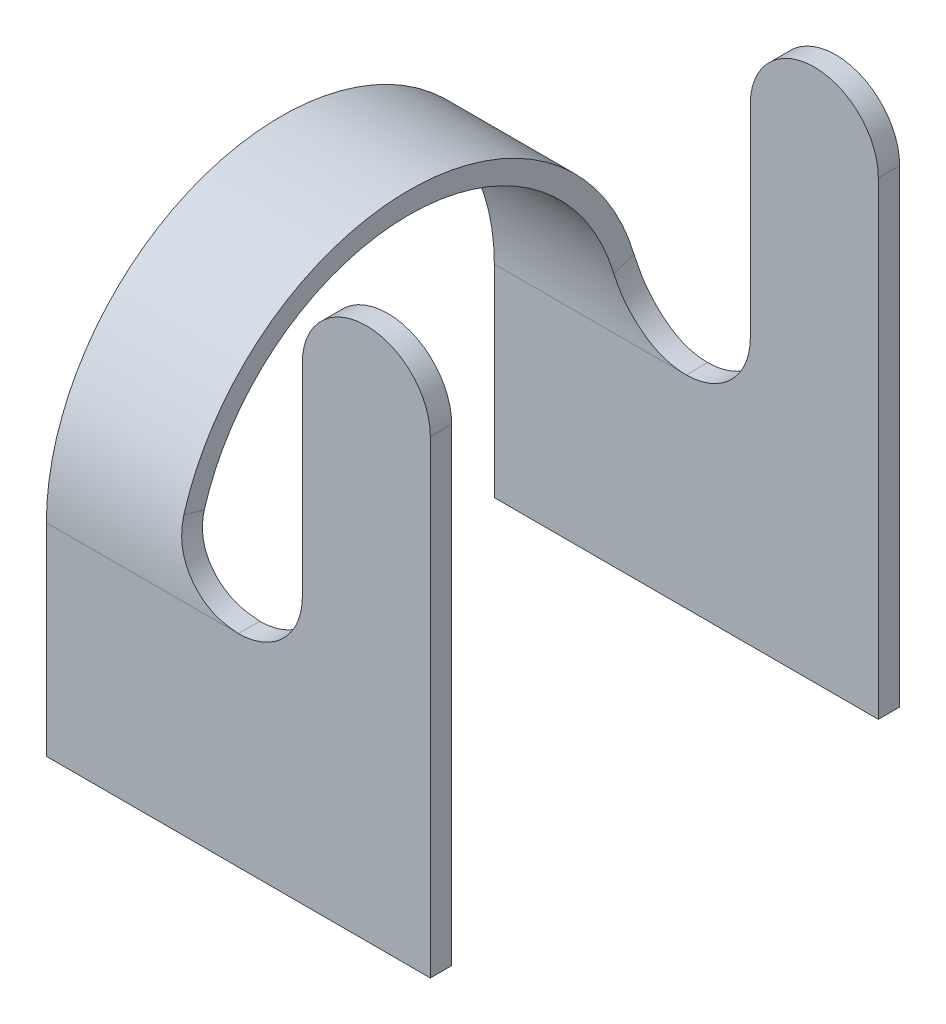
ISO-10303-21;
HEADER;
FILE_DESCRIPTION(('STEP AP214'),'2;1');
FILE_NAME('part.step','',(''),(''),'','','');
FILE_SCHEMA(('AUTOMOTIVE_DESIGN { 1 0 10303 214 1 1 1 1 }'));
ENDSEC;
DATA;
#1=APPLICATION_CONTEXT('core data for automotive mechanical design processes');
#2=APPLICATION_PROTOCOL_DEFINITION('international standard','automotive_design',2000,#1);
#3=PRODUCT_CONTEXT('',#1,'mechanical');
#4=PRODUCT('Part','Part','',(#3));
#5=PRODUCT_RELATED_PRODUCT_CATEGORY('part','',(#4));
#6=PRODUCT_DEFINITION_FORMATION('','',#4);
#7=PRODUCT_DEFINITION_CONTEXT('part definition',#1,'design');
#8=PRODUCT_DEFINITION('design','',#6,#7);
#9=PRODUCT_DEFINITION_SHAPE('','',#8);
#10=(LENGTH_UNIT() NAMED_UNIT(*) SI_UNIT(.MILLI.,.METRE.));
#11=(NAMED_UNIT(*) PLANE_ANGLE_UNIT() SI_UNIT($,.RADIAN.));
#12=(NAMED_UNIT(*) SI_UNIT($,.STERADIAN.) SOLID_ANGLE_UNIT());
#13=UNCERTAINTY_MEASURE_WITH_UNIT(LENGTH_MEASURE(1.E-05),#10,'distance_accuracy_value','');
#14=(GEOMETRIC_REPRESENTATION_CONTEXT(3) GLOBAL_UNCERTAINTY_ASSIGNED_CONTEXT((#13)) GLOBAL_UNIT_ASSIGNED_CONTEXT((#10,
#11,#12)) REPRESENTATION_CONTEXT('',''));
#15=CARTESIAN_POINT('',(0.,0.,0.));
#16=DIRECTION('',(0.,0.,1.));
#17=DIRECTION('',(1.,0.,0.));
#18=AXIS2_PLACEMENT_3D('',#15,#16,#17);
#19=CARTESIAN_POINT('',(0.,-26.9867228626931,42.));
#20=DIRECTION('',(0.,0.,-1.));
#21=DIRECTION('',(1.,0.,0.));
#22=AXIS2_PLACEMENT_3D('',#19,#20,#21);
#23=CYLINDRICAL_SURFACE('',#22,6.);
#24=CARTESIAN_POINT('',(0.,-26.9867228626931,40.));
#25=DIRECTION('',(0.,0.,-1.));
#26=DIRECTION('',(1.,0.,0.));
#27=AXIS2_PLACEMENT_3D('',#24,#25,#26);
#28=CIRCLE('',#27,6.);
#29=CARTESIAN_POINT('',(5.99999999999995,-26.9867228626931,40.));
#30=VERTEX_POINT('',#29);
#31=CARTESIAN_POINT('',(0.,-32.9867228626931,40.));
#32=VERTEX_POINT('',#31);
#33=EDGE_CURVE('E81',#30,#32,#28,.T.);
#34=ORIENTED_EDGE('',*,*,#33,.T.);
#35=CARTESIAN_POINT('',(0.,-32.9867228626928,42.));
#36=CARTESIAN_POINT('',(0.,-32.9867228626928,40.));
#37=B_SPLINE_CURVE_WITH_KNOTS('',1,(#35,#36),.UNSPECIFIED.,.F.,.F.,(2,2),(0.,1.),.UNSPECIFIED.);
#38=CARTESIAN_POINT('',(0.,-32.9867228626928,42.));
#39=VERTEX_POINT('',#38);
#40=EDGE_CURVE('E172',#32,#39,#37,.F.);
#41=ORIENTED_EDGE('',*,*,#40,.T.);
#42=CARTESIAN_POINT('',(0.,-26.9867228626931,42.));
#43=DIRECTION('',(0.,0.,-1.));
#44=DIRECTION('',(1.,0.,0.));
#45=AXIS2_PLACEMENT_3D('',#42,#43,#44);
#46=CIRCLE('',#45,6.);
#47=CARTESIAN_POINT('',(5.99999999999995,-26.9867228626932,42.));
#48=VERTEX_POINT('',#47);
#49=EDGE_CURVE('E174',#48,#39,#46,.T.);
#50=ORIENTED_EDGE('',*,*,#49,.F.);
#51=DIRECTION('',(0.,0.,-1.));
#52=VECTOR('',#51,1.);
#53=CARTESIAN_POINT('',(5.99999999999995,-26.9867228626932,42.));
#54=LINE('',#53,#52);
#55=EDGE_CURVE('E422',#48,#30,#54,.T.);
#56=ORIENTED_EDGE('',*,*,#55,.T.);
#57=EDGE_LOOP('',(#34,#41,#50,#56));
#58=FACE_BOUND('',#57,.T.);
#59=ADVANCED_FACE('F55',(#58),#23,.F.);
#60=CARTESIAN_POINT('',(-18.0000000000001,-51.9540885087415,41.9999999999999));
#61=DIRECTION('',(-1.,0.,0.));
#62=DIRECTION('',(0.,1.,0.));
#63=AXIS2_PLACEMENT_3D('',#60,#61,#62);
#64=PLANE('',#63);
#65=DIRECTION('',(0.,1.,0.));
#66=VECTOR('',#65,1.);
#67=CARTESIAN_POINT('',(-18.0000000000001,-51.9540885087415,41.9999999999999));
#68=LINE('',#67,#66);
#69=CARTESIAN_POINT('',(-18.0000000000001,-51.9540885087415,41.9999999999999));
#70=VERTEX_POINT('',#69);
#71=CARTESIAN_POINT('',(-18.,-32.9867228626932,42.));
#72=VERTEX_POINT('',#71);
#73=EDGE_CURVE('E428',#70,#72,#68,.T.);
#74=ORIENTED_EDGE('',*,*,#73,.T.);
#75=DIRECTION('',(0.,0.,-1.));
#76=VECTOR('',#75,1.);
#77=CARTESIAN_POINT('',(-18.,-32.9867228626932,42.0000000000001));
#78=LINE('',#77,#76);
#79=CARTESIAN_POINT('',(-18.,-32.9867228626932,40.));
#80=VERTEX_POINT('',#79);
#81=EDGE_CURVE('E12',#72,#80,#78,.T.);
#82=ORIENTED_EDGE('',*,*,#81,.T.);
#83=DIRECTION('',(0.,1.,0.));
#84=VECTOR('',#83,1.);
#85=CARTESIAN_POINT('',(-18.0000000000001,-51.9540885087415,39.9999999999999));
#86=LINE('',#85,#84);
#87=CARTESIAN_POINT('',(-18.0000000000001,-51.9540885087415,39.9999999999999));
#88=VERTEX_POINT('',#87);
#89=EDGE_CURVE('E74',#88,#80,#86,.T.);
#90=ORIENTED_EDGE('',*,*,#89,.F.);
#91=DIRECTION('',(0.,0.,-1.));
#92=VECTOR('',#91,1.);
#93=CARTESIAN_POINT('',(-18.0000000000001,-51.9540885087415,41.9999999999999));
#94=LINE('',#93,#92);
#95=EDGE_CURVE('E205',#70,#88,#94,.T.);
#96=ORIENTED_EDGE('',*,*,#95,.F.);
#97=EDGE_LOOP('',(#74,#82,#90,#96));
#98=FACE_BOUND('',#97,.T.);
#99=ADVANCED_FACE('F57',(#98),#64,.T.);
#100=CARTESIAN_POINT('',(0.,-3.05311331771918E-13,40.0000000000002));
#101=DIRECTION('',(0.,0.,-1.));
#102=DIRECTION('',(1.,0.,0.));
#103=AXIS2_PLACEMENT_3D('',#100,#101,#102);
#104=PLANE('',#103);
#105=ORIENTED_EDGE('',*,*,#89,.T.);
#106=DIRECTION('',(1.,0.,0.));
#107=VECTOR('',#106,1.);
#108=CARTESIAN_POINT('',(0.,-32.9867228626932,40.));
#109=LINE('',#108,#107);
#110=EDGE_CURVE('E66',#80,#32,#109,.T.);
#111=ORIENTED_EDGE('',*,*,#110,.T.);
#112=ORIENTED_EDGE('',*,*,#33,.F.);
#113=DIRECTION('',(0.,-1.,0.));
#114=VECTOR('',#113,1.);
#115=CARTESIAN_POINT('',(5.99999999999995,-26.9867228626931,40.));
#116=LINE('',#115,#114);
#117=CARTESIAN_POINT('',(5.99999999999998,-7.98672286269313,40.0000000000002));
#118=VERTEX_POINT('',#117);
#119=EDGE_CURVE('E191',#118,#30,#116,.T.);
#120=ORIENTED_EDGE('',*,*,#119,.F.);
#121=CARTESIAN_POINT('',(12.,-7.98672286269315,40.0000000000002));
#122=DIRECTION('',(0.,0.,1.));
#123=DIRECTION('',(1.,0.,0.));
#124=AXIS2_PLACEMENT_3D('',#121,#122,#123);
#125=CIRCLE('',#124,6.);
#126=CARTESIAN_POINT('',(18.,-7.98672286269315,40.0000000000002));
#127=VERTEX_POINT('',#126);
#128=EDGE_CURVE('E416',#127,#118,#125,.T.);
#129=ORIENTED_EDGE('',*,*,#128,.F.);
#130=DIRECTION('',(0.,-1.,0.));
#131=VECTOR('',#130,1.);
#132=CARTESIAN_POINT('',(17.9999999999999,-51.9540885087415,39.9999999999999));
#133=LINE('',#132,#131);
#134=CARTESIAN_POINT('',(17.9999999999999,-51.9540885087415,39.9999999999999));
#135=VERTEX_POINT('',#134);
#136=EDGE_CURVE('E424',#127,#135,#133,.T.);
#137=ORIENTED_EDGE('',*,*,#136,.T.);
#138=DIRECTION('',(-1.,0.,0.));
#139=VECTOR('',#138,1.);
#140=CARTESIAN_POINT('',(-18.0000000000001,-51.9540885087415,39.9999999999999));
#141=LINE('',#140,#139);
#142=EDGE_CURVE('E430',#135,#88,#141,.T.);
#143=ORIENTED_EDGE('',*,*,#142,.T.);
#144=EDGE_LOOP('',(#105,#111,#112,#120,#129,#137,#143));
#145=FACE_BOUND('',#144,.T.);
#146=ADVANCED_FACE('F450',(#145),#104,.T.);
#147=CARTESIAN_POINT('',(17.9999999999999,-51.9540885087415,41.9999999999999));
#148=DIRECTION('',(1.,0.,0.));
#149=DIRECTION('',(0.,-1.,0.));
#150=AXIS2_PLACEMENT_3D('',#147,#148,#149);
#151=PLANE('',#150);
#152=ORIENTED_EDGE('',*,*,#136,.F.);
#153=DIRECTION('',(0.,0.,-1.));
#154=VECTOR('',#153,1.);
#155=CARTESIAN_POINT('',(18.,-7.98672286269317,42.0000000000002));
#156=LINE('',#155,#154);
#157=CARTESIAN_POINT('',(18.,-7.98672286269317,42.0000000000002));
#158=VERTEX_POINT('',#157);
#159=EDGE_CURVE('E418',#158,#127,#156,.T.);
#160=ORIENTED_EDGE('',*,*,#159,.F.);
#161=DIRECTION('',(0.,-1.,0.));
#162=VECTOR('',#161,1.);
#163=CARTESIAN_POINT('',(17.9999999999999,-51.9540885087415,41.9999999999999));
#164=LINE('',#163,#162);
#165=CARTESIAN_POINT('',(17.9999999999999,-51.9540885087415,41.9999999999999));
#166=VERTEX_POINT('',#165);
#167=EDGE_CURVE('E429',#158,#166,#164,.T.);
#168=ORIENTED_EDGE('',*,*,#167,.T.);
#169=DIRECTION('',(0.,0.,-1.));
#170=VECTOR('',#169,1.);
#171=CARTESIAN_POINT('',(17.9999999999999,-51.9540885087415,41.9999999999999));
#172=LINE('',#171,#170);
#173=EDGE_CURVE('E433',#166,#135,#172,.T.);
#174=ORIENTED_EDGE('',*,*,#173,.T.);
#175=EDGE_LOOP('',(#152,#160,#168,#174));
#176=FACE_BOUND('',#175,.T.);
#177=ADVANCED_FACE('F463',(#176),#151,.T.);
#178=CARTESIAN_POINT('',(5.99999999999995,-26.9867228626932,42.));
#179=DIRECTION('',(1.,0.,0.));
#180=DIRECTION('',(0.,-1.,0.));
#181=AXIS2_PLACEMENT_3D('',#178,#179,#180);
#182=PLANE('',#181);
#183=DIRECTION('',(0.,0.,-1.));
#184=VECTOR('',#183,1.);
#185=CARTESIAN_POINT('',(5.99999999999999,-7.98672286269315,42.0000000000002));
#186=LINE('',#185,#184);
#187=CARTESIAN_POINT('',(5.99999999999999,-7.98672286269315,42.0000000000002));
#188=VERTEX_POINT('',#187);
#189=EDGE_CURVE('E415',#188,#118,#186,.T.);
#190=ORIENTED_EDGE('',*,*,#189,.T.);
#191=ORIENTED_EDGE('',*,*,#119,.T.);
#192=ORIENTED_EDGE('',*,*,#55,.F.);
#193=DIRECTION('',(0.,-1.,0.));
#194=VECTOR('',#193,1.);
#195=CARTESIAN_POINT('',(5.99999999999995,-26.9867228626932,42.));
#196=LINE('',#195,#194);
#197=EDGE_CURVE('E189',#188,#48,#196,.T.);
#198=ORIENTED_EDGE('',*,*,#197,.F.);
#199=EDGE_LOOP('',(#190,#191,#192,#198));
#200=FACE_BOUND('',#199,.T.);
#201=ADVANCED_FACE('F455',(#200),#182,.F.);
#202=CARTESIAN_POINT('',(-18.0000000000001,-51.9540885087415,41.9999999999999));
#203=DIRECTION('',(0.,-1.,0.));
#204=DIRECTION('',(0.,0.,-1.));
#205=AXIS2_PLACEMENT_3D('',#202,#203,#204);
#206=PLANE('',#205);
#207=ORIENTED_EDGE('',*,*,#142,.F.);
#208=ORIENTED_EDGE('',*,*,#173,.F.);
#209=DIRECTION('',(-1.,0.,0.));
#210=VECTOR('',#209,1.);
#211=CARTESIAN_POINT('',(-18.0000000000001,-51.9540885087415,41.9999999999999));
#212=LINE('',#211,#210);
#213=EDGE_CURVE('E425',#166,#70,#212,.T.);
#214=ORIENTED_EDGE('',*,*,#213,.T.);
#215=ORIENTED_EDGE('',*,*,#95,.T.);
#216=EDGE_LOOP('',(#207,#208,#214,#215));
#217=FACE_BOUND('',#216,.T.);
#218=ADVANCED_FACE('F466',(#217),#206,.T.);
#219=CARTESIAN_POINT('',(0.,-3.19277257127291E-13,42.0000000000002));
#220=DIRECTION('',(0.,0.,-1.));
#221=DIRECTION('',(1.,0.,0.));
#222=AXIS2_PLACEMENT_3D('',#219,#220,#221);
#223=PLANE('',#222);
#224=DIRECTION('',(1.,0.,0.));
#225=VECTOR('',#224,1.);
#226=CARTESIAN_POINT('',(0.,-32.9867228626932,42.));
#227=LINE('',#226,#225);
#228=EDGE_CURVE('E180',#72,#39,#227,.T.);
#229=ORIENTED_EDGE('',*,*,#228,.F.);
#230=ORIENTED_EDGE('',*,*,#73,.F.);
#231=ORIENTED_EDGE('',*,*,#213,.F.);
#232=ORIENTED_EDGE('',*,*,#167,.F.);
#233=CARTESIAN_POINT('',(12.,-7.98672286269316,42.0000000000002));
#234=DIRECTION('',(0.,0.,1.));
#235=DIRECTION('',(1.,0.,0.));
#236=AXIS2_PLACEMENT_3D('',#233,#234,#235);
#237=CIRCLE('',#236,6.);
#238=EDGE_CURVE('E413',#158,#188,#237,.T.);
#239=ORIENTED_EDGE('',*,*,#238,.T.);
#240=ORIENTED_EDGE('',*,*,#197,.T.);
#241=ORIENTED_EDGE('',*,*,#49,.T.);
#242=EDGE_LOOP('',(#229,#230,#231,#232,#239,#240,#241));
#243=FACE_BOUND('',#242,.T.);
#244=ADVANCED_FACE('F184',(#243),#223,.F.);
#245=CARTESIAN_POINT('',(12.,-7.98672286269316,42.0000000000002));
#246=DIRECTION('',(0.,0.,-1.));
#247=DIRECTION('',(1.,0.,0.));
#248=AXIS2_PLACEMENT_3D('',#245,#246,#247);
#249=CYLINDRICAL_SURFACE('',#248,6.);
#250=ORIENTED_EDGE('',*,*,#128,.T.);
#251=ORIENTED_EDGE('',*,*,#189,.F.);
#252=ORIENTED_EDGE('',*,*,#238,.F.);
#253=ORIENTED_EDGE('',*,*,#159,.T.);
#254=EDGE_LOOP('',(#250,#251,#252,#253));
#255=FACE_BOUND('',#254,.T.);
#256=ADVANCED_FACE('F457',(#255),#249,.T.);
#257=CARTESIAN_POINT('',(-18.,-51.9540885087412,-2.));
#258=DIRECTION('',(0.,-1.,0.));
#259=DIRECTION('',(0.,0.,-1.));
#260=AXIS2_PLACEMENT_3D('',#257,#258,#259);
#261=PLANE('',#260);
#262=DIRECTION('',(1.,0.,0.));
#263=VECTOR('',#262,1.);
#264=CARTESIAN_POINT('',(-18.,-51.9540885087412,0.));
#265=LINE('',#264,#263);
#266=CARTESIAN_POINT('',(-18.,-51.9540885087412,0.));
#267=VERTEX_POINT('',#266);
#268=CARTESIAN_POINT('',(18.,-51.9540885087412,0.));
#269=VERTEX_POINT('',#268);
#270=EDGE_CURVE('E521',#267,#269,#265,.T.);
#271=ORIENTED_EDGE('',*,*,#270,.F.);
#272=DIRECTION('',(0.,0.,1.));
#273=VECTOR('',#272,1.);
#274=CARTESIAN_POINT('',(-18.,-51.9540885087412,-2.));
#275=LINE('',#274,#273);
#276=CARTESIAN_POINT('',(-18.,-51.9540885087412,-2.));
#277=VERTEX_POINT('',#276);
#278=EDGE_CURVE('E291',#277,#267,#275,.T.);
#279=ORIENTED_EDGE('',*,*,#278,.F.);
#280=DIRECTION('',(1.,0.,0.));
#281=VECTOR('',#280,1.);
#282=CARTESIAN_POINT('',(-18.,-51.9540885087412,-2.));
#283=LINE('',#282,#281);
#284=CARTESIAN_POINT('',(18.,-51.9540885087412,-2.));
#285=VERTEX_POINT('',#284);
#286=EDGE_CURVE('E397',#277,#285,#283,.T.);
#287=ORIENTED_EDGE('',*,*,#286,.T.);
#288=DIRECTION('',(0.,0.,1.));
#289=VECTOR('',#288,1.);
#290=CARTESIAN_POINT('',(18.,-51.9540885087412,-2.));
#291=LINE('',#290,#289);
#292=EDGE_CURVE('E525',#285,#269,#291,.T.);
#293=ORIENTED_EDGE('',*,*,#292,.T.);
#294=EDGE_LOOP('',(#271,#279,#287,#293));
#295=FACE_BOUND('',#294,.T.);
#296=ADVANCED_FACE('F487',(#295),#261,.T.);
#297=CARTESIAN_POINT('',(18.,51.9540885087412,-2.));
#298=DIRECTION('',(1.,0.,0.));
#299=DIRECTION('',(0.,1.,0.));
#300=AXIS2_PLACEMENT_3D('',#297,#298,#299);
#301=PLANE('',#300);
#302=DIRECTION('',(0.,0.,1.));
#303=VECTOR('',#302,1.);
#304=CARTESIAN_POINT('',(18.,-7.98672286269282,-2.));
#305=LINE('',#304,#303);
#306=CARTESIAN_POINT('',(18.,-7.98672286269282,-2.));
#307=VERTEX_POINT('',#306);
#308=CARTESIAN_POINT('',(18.,-7.98672286269282,0.));
#309=VERTEX_POINT('',#308);
#310=EDGE_CURVE('E554',#307,#309,#305,.T.);
#311=ORIENTED_EDGE('',*,*,#310,.T.);
#312=DIRECTION('',(0.,1.,0.));
#313=VECTOR('',#312,1.);
#314=CARTESIAN_POINT('',(18.,51.9540885087412,0.));
#315=LINE('',#314,#313);
#316=EDGE_CURVE('E528',#269,#309,#315,.T.);
#317=ORIENTED_EDGE('',*,*,#316,.F.);
#318=ORIENTED_EDGE('',*,*,#292,.F.);
#319=DIRECTION('',(0.,1.,0.));
#320=VECTOR('',#319,1.);
#321=CARTESIAN_POINT('',(18.,51.9540885087412,-2.));
#322=LINE('',#321,#320);
#323=EDGE_CURVE('E551',#285,#307,#322,.T.);
#324=ORIENTED_EDGE('',*,*,#323,.T.);
#325=EDGE_LOOP('',(#311,#317,#318,#324));
#326=FACE_BOUND('',#325,.T.);
#327=ADVANCED_FACE('F510',(#326),#301,.T.);
#328=CARTESIAN_POINT('',(12.,-7.98672286269282,-2.));
#329=DIRECTION('',(0.,0.,1.));
#330=DIRECTION('',(1.,0.,0.));
#331=AXIS2_PLACEMENT_3D('',#328,#329,#330);
#332=CYLINDRICAL_SURFACE('',#331,6.);
#333=CARTESIAN_POINT('',(12.,-7.98672286269282,0.));
#334=DIRECTION('',(0.,0.,-1.));
#335=DIRECTION('',(-1.,0.,0.));
#336=AXIS2_PLACEMENT_3D('',#333,#334,#335);
#337=CIRCLE('',#336,6.);
#338=CARTESIAN_POINT('',(6.,-7.98672286269282,0.));
#339=VERTEX_POINT('',#338);
#340=EDGE_CURVE('E549',#339,#309,#337,.T.);
#341=ORIENTED_EDGE('',*,*,#340,.T.);
#342=ORIENTED_EDGE('',*,*,#310,.F.);
#343=CARTESIAN_POINT('',(12.,-7.98672286269282,-2.));
#344=DIRECTION('',(0.,0.,-1.));
#345=DIRECTION('',(-1.,0.,0.));
#346=AXIS2_PLACEMENT_3D('',#343,#344,#345);
#347=CIRCLE('',#346,6.);
#348=CARTESIAN_POINT('',(6.,-7.98672286269282,-2.));
#349=VERTEX_POINT('',#348);
#350=EDGE_CURVE('E410',#349,#307,#347,.T.);
#351=ORIENTED_EDGE('',*,*,#350,.F.);
#352=DIRECTION('',(0.,0.,1.));
#353=VECTOR('',#352,1.);
#354=CARTESIAN_POINT('',(6.,-7.98672286269282,-2.));
#355=LINE('',#354,#353);
#356=EDGE_CURVE('E547',#349,#339,#355,.T.);
#357=ORIENTED_EDGE('',*,*,#356,.T.);
#358=EDGE_LOOP('',(#341,#342,#351,#357));
#359=FACE_BOUND('',#358,.T.);
#360=ADVANCED_FACE('F506',(#359),#332,.T.);
#361=CARTESIAN_POINT('',(5.99999999999999,26.9867228626928,-2.));
#362=DIRECTION('',(1.,0.,0.));
#363=DIRECTION('',(0.,1.,0.));
#364=AXIS2_PLACEMENT_3D('',#361,#362,#363);
#365=PLANE('',#364);
#366=DIRECTION('',(0.,1.,0.));
#367=VECTOR('',#366,1.);
#368=CARTESIAN_POINT('',(5.99999999999999,26.9867228626928,0.));
#369=LINE('',#368,#367);
#370=CARTESIAN_POINT('',(6.,-26.9867228626928,0.));
#371=VERTEX_POINT('',#370);
#372=EDGE_CURVE('E544',#371,#339,#369,.T.);
#373=ORIENTED_EDGE('',*,*,#372,.T.);
#374=ORIENTED_EDGE('',*,*,#356,.F.);
#375=DIRECTION('',(0.,1.,0.));
#376=VECTOR('',#375,1.);
#377=CARTESIAN_POINT('',(5.99999999999999,26.9867228626928,-2.));
#378=LINE('',#377,#376);
#379=CARTESIAN_POINT('',(6.,-26.9867228626928,-2.));
#380=VERTEX_POINT('',#379);
#381=EDGE_CURVE('E536',#380,#349,#378,.T.);
#382=ORIENTED_EDGE('',*,*,#381,.F.);
#383=DIRECTION('',(0.,0.,1.));
#384=VECTOR('',#383,1.);
#385=CARTESIAN_POINT('',(6.,-26.9867228626928,-2.));
#386=LINE('',#385,#384);
#387=EDGE_CURVE('E540',#380,#371,#386,.T.);
#388=ORIENTED_EDGE('',*,*,#387,.T.);
#389=EDGE_LOOP('',(#373,#374,#382,#388));
#390=FACE_BOUND('',#389,.T.);
#391=ADVANCED_FACE('F502',(#390),#365,.F.);
#392=CARTESIAN_POINT('',(0.,0.,-2.));
#393=DIRECTION('',(0.,0.,1.));
#394=DIRECTION('',(1.,0.,0.));
#395=AXIS2_PLACEMENT_3D('',#392,#393,#394);
#396=PLANE('',#395);
#397=DIRECTION('',(0.,-1.,0.));
#398=VECTOR('',#397,1.);
#399=CARTESIAN_POINT('',(-18.,51.9540885087412,-2.));
#400=LINE('',#399,#398);
#401=CARTESIAN_POINT('',(-18.,-32.9867228626929,-2.));
#402=VERTEX_POINT('',#401);
#403=EDGE_CURVE('E530',#402,#277,#400,.T.);
#404=ORIENTED_EDGE('',*,*,#403,.F.);
#405=DIRECTION('',(1.,0.,0.));
#406=VECTOR('',#405,1.);
#407=CARTESIAN_POINT('',(0.,-32.9867228626929,-2.));
#408=LINE('',#407,#406);
#409=CARTESIAN_POINT('',(0.,-32.9867228626928,-2.));
#410=VERTEX_POINT('',#409);
#411=EDGE_CURVE('E543',#402,#410,#408,.T.);
#412=ORIENTED_EDGE('',*,*,#411,.T.);
#413=CARTESIAN_POINT('',(0.,-26.9867228626928,-2.));
#414=DIRECTION('',(0.,0.,1.));
#415=DIRECTION('',(1.,0.,0.));
#416=AXIS2_PLACEMENT_3D('',#413,#414,#415);
#417=CIRCLE('',#416,6.);
#418=EDGE_CURVE('E539',#410,#380,#417,.T.);
#419=ORIENTED_EDGE('',*,*,#418,.T.);
#420=ORIENTED_EDGE('',*,*,#381,.T.);
#421=ORIENTED_EDGE('',*,*,#350,.T.);
#422=ORIENTED_EDGE('',*,*,#323,.F.);
#423=ORIENTED_EDGE('',*,*,#286,.F.);
#424=EDGE_LOOP('',(#404,#412,#419,#420,#421,#422,#423));
#425=FACE_BOUND('',#424,.T.);
#426=ADVANCED_FACE('F498',(#425),#396,.F.);
#427=CARTESIAN_POINT('',(0.,-26.9867228626928,-2.));
#428=DIRECTION('',(0.,0.,1.));
#429=DIRECTION('',(1.,0.,0.));
#430=AXIS2_PLACEMENT_3D('',#427,#428,#429);
#431=CYLINDRICAL_SURFACE('',#430,6.);
#432=CARTESIAN_POINT('',(0.,-32.9867228626929,0.));
#433=CARTESIAN_POINT('',(0.,-32.9867228626928,-2.));
#434=B_SPLINE_CURVE_WITH_KNOTS('',1,(#432,#433),.UNSPECIFIED.,.F.,.F.,(2,2),(0.,1.),.UNSPECIFIED.);
#435=CARTESIAN_POINT('',(0.,-32.9867228626928,0.));
#436=VERTEX_POINT('',#435);
#437=EDGE_CURVE('E287',#436,#410,#434,.T.);
#438=ORIENTED_EDGE('',*,*,#437,.F.);
#439=CARTESIAN_POINT('',(0.,-26.9867228626928,0.));
#440=DIRECTION('',(0.,0.,1.));
#441=DIRECTION('',(1.,0.,0.));
#442=AXIS2_PLACEMENT_3D('',#439,#440,#441);
#443=CIRCLE('',#442,6.);
#444=EDGE_CURVE('E407',#436,#371,#443,.T.);
#445=ORIENTED_EDGE('',*,*,#444,.T.);
#446=ORIENTED_EDGE('',*,*,#387,.F.);
#447=ORIENTED_EDGE('',*,*,#418,.F.);
#448=EDGE_LOOP('',(#438,#445,#446,#447));
#449=FACE_BOUND('',#448,.T.);
#450=ADVANCED_FACE('F494',(#449),#431,.F.);
#451=CARTESIAN_POINT('',(0.,0.,0.));
#452=DIRECTION('',(0.,0.,1.));
#453=DIRECTION('',(1.,0.,0.));
#454=AXIS2_PLACEMENT_3D('',#451,#452,#453);
#455=PLANE('',#454);
#456=DIRECTION('',(1.,0.,0.));
#457=VECTOR('',#456,1.);
#458=CARTESIAN_POINT('',(0.,-32.9867228626929,0.));
#459=LINE('',#458,#457);
#460=CARTESIAN_POINT('',(-18.,-32.9867228626929,0.));
#461=VERTEX_POINT('',#460);
#462=EDGE_CURVE('E394',#461,#436,#459,.T.);
#463=ORIENTED_EDGE('',*,*,#462,.F.);
#464=DIRECTION('',(0.,-1.,0.));
#465=VECTOR('',#464,1.);
#466=CARTESIAN_POINT('',(-18.,51.9540885087412,0.));
#467=LINE('',#466,#465);
#468=EDGE_CURVE('E409',#461,#267,#467,.T.);
#469=ORIENTED_EDGE('',*,*,#468,.T.);
#470=ORIENTED_EDGE('',*,*,#270,.T.);
#471=ORIENTED_EDGE('',*,*,#316,.T.);
#472=ORIENTED_EDGE('',*,*,#340,.F.);
#473=ORIENTED_EDGE('',*,*,#372,.F.);
#474=ORIENTED_EDGE('',*,*,#444,.F.);
#475=EDGE_LOOP('',(#463,#469,#470,#471,#472,#473,#474));
#476=FACE_BOUND('',#475,.T.);
#477=ADVANCED_FACE('F491',(#476),#455,.T.);
#478=CARTESIAN_POINT('',(-18.,51.9540885087412,-2.));
#479=DIRECTION('',(-1.,0.,0.));
#480=DIRECTION('',(0.,-1.,0.));
#481=AXIS2_PLACEMENT_3D('',#478,#479,#480);
#482=PLANE('',#481);
#483=DIRECTION('',(0.,0.,1.));
#484=VECTOR('',#483,1.);
#485=CARTESIAN_POINT('',(-18.,-32.9867228626929,-2.00000000000059));
#486=LINE('',#485,#484);
#487=EDGE_CURVE('E392',#402,#461,#486,.T.);
#488=ORIENTED_EDGE('',*,*,#487,.F.);
#489=ORIENTED_EDGE('',*,*,#403,.T.);
#490=ORIENTED_EDGE('',*,*,#278,.T.);
#491=ORIENTED_EDGE('',*,*,#468,.F.);
#492=EDGE_LOOP('',(#488,#489,#490,#491));
#493=FACE_BOUND('',#492,.T.);
#494=ADVANCED_FACE('F488',(#493),#482,.T.);
#495=CARTESIAN_POINT('',(-18.,-32.9867228626929,20.));
#496=DIRECTION('',(-1.,0.,0.));
#497=DIRECTION('',(0.,-1.,0.));
#498=AXIS2_PLACEMENT_3D('',#495,#496,#497);
#499=PLANE('',#498);
#500=ORIENTED_EDGE('',*,*,#487,.T.);
#501=CARTESIAN_POINT('',(-18.,-32.9867228626929,20.));
#502=DIRECTION('',(1.,0.,0.));
#503=DIRECTION('',(0.,1.,0.));
#504=AXIS2_PLACEMENT_3D('',#501,#502,#503);
#505=CIRCLE('',#504,20.);
#506=EDGE_CURVE('E366',#461,#80,#505,.T.);
#507=ORIENTED_EDGE('',*,*,#506,.T.);
#508=ORIENTED_EDGE('',*,*,#81,.F.);
#509=CARTESIAN_POINT('',(-18.,-32.9867228626929,20.));
#510=DIRECTION('',(1.,0.,0.));
#511=DIRECTION('',(0.,-1.,0.));
#512=AXIS2_PLACEMENT_3D('',#509,#510,#511);
#513=CIRCLE('',#512,22.);
#514=EDGE_CURVE('E204',#402,#72,#513,.T.);
#515=ORIENTED_EDGE('',*,*,#514,.F.);
#516=EDGE_LOOP('',(#500,#507,#508,#515));
#517=FACE_BOUND('',#516,.T.);
#518=ADVANCED_FACE('F236',(#517),#499,.T.);
#519=CARTESIAN_POINT('',(0.,-32.9867228626928,42.));
#520=CARTESIAN_POINT('',(-0.502906553633893,-32.9470546089668,42.));
#521=CARTESIAN_POINT('',(-0.949601764800088,-32.8860324998505,41.9999237954545));
#522=CARTESIAN_POINT('',(-1.53532745558675,-32.7624750573938,41.9988956384306));
#523=CARTESIAN_POINT('',(-1.71651650442527,-32.7159519888384,41.9983947820568));
#524=CARTESIAN_POINT('',(-1.96722080554748,-32.6381646604505,41.9972539114088));
#525=CARTESIAN_POINT('',(-2.04727569389894,-32.6109017863705,41.9968083261621));
#526=CARTESIAN_POINT('',(-2.16208820839226,-32.5680074799685,41.9960196838678));
#527=CARTESIAN_POINT('',(-2.19948074355106,-32.5533760473475,41.9957367363034));
#528=CARTESIAN_POINT('',(-2.25425209178077,-32.5309290044511,41.9952792200411));
#529=CARTESIAN_POINT('',(-2.27228963210593,-32.5233633413088,41.9951211973815));
#530=CARTESIAN_POINT('',(-2.29901657896655,-32.5118898874648,41.9948755004211));
#531=CARTESIAN_POINT('',(-2.30787066731558,-32.5080445763385,41.9947921575171));
#532=CARTESIAN_POINT('',(-2.32106945893234,-32.5022453717415,41.9946649280982));
#533=CARTESIAN_POINT('',(-2.32545533265345,-32.5003070972252,41.9946221491092));
#534=CARTESIAN_POINT('',(-2.33419963312677,-32.4964201358761,41.9945358445014));
#535=CARTESIAN_POINT('',(-2.33713083863761,-32.4951132966397,41.9945067409077));
#536=CARTESIAN_POINT('',(-2.71230593172808,-32.3263901689572,41.9907156085524));
#537=CARTESIAN_POINT('',(-3.0594391252847,-32.1267983774381,41.9844240035277));
#538=CARTESIAN_POINT('',(-3.54673395308246,-31.7774730888251,41.9670504894537));
#539=CARTESIAN_POINT('',(-3.70359806859219,-31.652710992735,41.9599223785556));
#540=CARTESIAN_POINT('',(-4.00619131209926,-31.386632175925,41.9421395569232));
#541=CARTESIAN_POINT('',(-4.1511245525748,-31.2461642026391,41.9315580413018));
#542=CARTESIAN_POINT('',(-5.41974224844144,-29.8927408292981,41.8147968024935));
#543=CARTESIAN_POINT('',(-5.98903693148643,-28.4389041424363,41.5936227176085));
#544=CARTESIAN_POINT('',(-6.00000000000004,-26.7861801160042,41.1081327844622));
#545=CARTESIAN_POINT('',(0.,-32.9867228626928,40.));
#546=CARTESIAN_POINT('',(-0.502906557941379,-32.9506608135421,40.));
#547=CARTESIAN_POINT('',(-0.949601764800088,-32.8951861691998,39.9999307231405));
#548=CARTESIAN_POINT('',(-1.53532745558675,-32.7828612215119,39.9989960349369));
#549=CARTESIAN_POINT('',(-1.71651650442527,-32.7405675228252,39.9985407109607));
#550=CARTESIAN_POINT('',(-1.96722080554748,-32.6698517697453,39.9975035558261));
#551=CARTESIAN_POINT('',(-2.04727569389894,-32.6450673387635,39.9970984783292));
#552=CARTESIAN_POINT('',(-2.16208820839226,-32.6060725147616,39.9963815307889));
#553=CARTESIAN_POINT('',(-2.19948074355106,-32.5927712123789,39.9961243057303));
#554=CARTESIAN_POINT('',(-2.25425209178077,-32.5723648097458,39.9957083818556));
#555=CARTESIAN_POINT('',(-2.27228963210593,-32.5654869341619,39.9955647248923));
#556=CARTESIAN_POINT('',(-2.29901657896655,-32.5550565215764,39.9953413640192));
#557=CARTESIAN_POINT('',(-2.30787066731558,-32.5515607841889,39.9952655977429));
#558=CARTESIAN_POINT('',(-2.32106945893234,-32.5462887800098,39.9951499346347));
#559=CARTESIAN_POINT('',(-2.32545533265345,-32.5445267122677,39.9951110446447));
#560=CARTESIAN_POINT('',(-2.33419963312677,-32.5409931110413,39.9950325859103));
#561=CARTESIAN_POINT('',(-2.33713083863761,-32.5398050753718,39.9950061280979));
#562=CARTESIAN_POINT('',(-2.71230593172808,-32.3864204138422,39.9915596441385));
#563=CARTESIAN_POINT('',(-3.0594391252847,-32.2049733306431,39.985840003207));
#564=CARTESIAN_POINT('',(-3.54673395308246,-31.8874048864494,39.9700458995033));
#565=CARTESIAN_POINT('',(-3.70359806859219,-31.7739847990948,39.9635657986869));
#566=CARTESIAN_POINT('',(-4.00619131209926,-31.5320949656312,39.9473995972029));
#567=CARTESIAN_POINT('',(-4.1511245525748,-31.4043968080985,39.9377800375471));
#568=CARTESIAN_POINT('',(-5.41974224844144,-30.1740119232431,39.8316334568123));
#569=CARTESIAN_POINT('',(-5.98903693158248,-28.8523421947508,39.63056610305));
#570=CARTESIAN_POINT('',(-6.00000000000004,-27.3498658202486,39.1892116222383));
#571=B_SPLINE_SURFACE_WITH_KNOTS('',1,3,((#519,#520,#521,#522,#523,#524,#525,#526,#527,#528,
#529,#530,#531,#532,#533,#534,#535,#536,#537,#538,#539,#540,#541,#542,#543,#544),(#545,#546,
#547,#548,#549,#550,#551,#552,#553,#554,#555,#556,#557,#558,#559,#560,#561,#562,#563,#564,#565,
#566,#567,#568,#569,#570)),.UNSPECIFIED.,.F.,.F.,.F.,(2,2),(4,2,2,2,2,2,2,2,2,2,2,2,4),(0.,1.),
(0.,0.125,0.1875,0.21875,0.234375,0.2421875,0.24609375,0.248046875,0.25,0.375,0.4375,0.5,1.),.UNSPECIFIED.);
#572=CARTESIAN_POINT('',(0.,-32.9867228626928,40.));
#573=CARTESIAN_POINT('',(-0.502906557941379,-32.9506608135421,40.));
#574=CARTESIAN_POINT('',(-0.949601764800088,-32.8951861691998,39.9999307231405));
#575=CARTESIAN_POINT('',(-1.53532745558675,-32.7828612215119,39.9989960349369));
#576=CARTESIAN_POINT('',(-1.71651650442527,-32.7405675228252,39.9985407109607));
#577=CARTESIAN_POINT('',(-1.96722080554748,-32.6698517697453,39.9975035558261));
#578=CARTESIAN_POINT('',(-2.04727569389894,-32.6450673387635,39.9970984783292));
#579=CARTESIAN_POINT('',(-2.16208820839226,-32.6060725147616,39.9963815307889));
#580=CARTESIAN_POINT('',(-2.19948074355106,-32.5927712123789,39.9961243057303));
#581=CARTESIAN_POINT('',(-2.25425209178077,-32.5723648097458,39.9957083818556));
#582=CARTESIAN_POINT('',(-2.27228963210593,-32.5654869341619,39.9955647248923));
#583=CARTESIAN_POINT('',(-2.29901657896655,-32.5550565215764,39.9953413640192));
#584=CARTESIAN_POINT('',(-2.30787066731558,-32.5515607841889,39.9952655977429));
#585=CARTESIAN_POINT('',(-2.32106945893234,-32.5462887800098,39.9951499346347));
#586=CARTESIAN_POINT('',(-2.32545533265345,-32.5445267122677,39.9951110446447));
#587=CARTESIAN_POINT('',(-2.33419963312677,-32.5409931110413,39.9950325859103));
#588=CARTESIAN_POINT('',(-2.33713083863761,-32.5398050753718,39.9950061280979));
#589=CARTESIAN_POINT('',(-2.71230593172808,-32.3864204138422,39.9915596441385));
#590=CARTESIAN_POINT('',(-3.0594391252847,-32.2049733306431,39.985840003207));
#591=CARTESIAN_POINT('',(-3.54673395308246,-31.8874048864494,39.9700458995033));
#592=CARTESIAN_POINT('',(-3.70359806859219,-31.7739847990948,39.9635657986869));
#593=CARTESIAN_POINT('',(-4.00619131209926,-31.5320949656312,39.9473995972029));
#594=CARTESIAN_POINT('',(-4.1511245525748,-31.4043968080985,39.9377800375471));
#595=CARTESIAN_POINT('',(-5.41974224844144,-30.1740119232431,39.8316334568123));
#596=CARTESIAN_POINT('',(-5.98903693158248,-28.8523421947508,39.63056610305));
#597=CARTESIAN_POINT('',(-6.00000000000004,-27.3498658202486,39.1892116222383));
#598=B_SPLINE_CURVE_WITH_KNOTS('',3,(#572,#573,#574,#575,#576,#577,#578,#579,#580,#581,#582,
#583,#584,#585,#586,#587,#588,#589,#590,#591,#592,#593,#594,#595,#596,#597),.UNSPECIFIED.,.F.,
.F.,(4,2,2,2,2,2,2,2,2,2,2,2,4),(0.,0.125,0.1875,0.21875,0.234375,0.2421875,0.24609375,
0.248046875,0.25,0.375,0.4375,0.5,1.),.UNSPECIFIED.);
#599=CARTESIAN_POINT('',(-6.00000000000004,-27.3498658202486,39.1892116222383));
#600=VERTEX_POINT('',#599);
#601=EDGE_CURVE('E351',#32,#600,#598,.T.);
#602=CARTESIAN_POINT('',(-6.00000000000004,-27.3498658202486,39.1892116222383));
#603=CARTESIAN_POINT('',(-6.00000000000004,-26.7861801160042,41.1081327844622));
#604=B_SPLINE_CURVE_WITH_KNOTS('',1,(#602,#603),.UNSPECIFIED.,.F.,.F.,(2,2),(0.,1.),.UNSPECIFIED.);
#605=CARTESIAN_POINT('',(-6.00000000000004,-26.7861801160042,41.1081327844622));
#606=VERTEX_POINT('',#605);
#607=EDGE_CURVE('E209',#600,#606,#604,.T.);
#608=CARTESIAN_POINT('',(-6.00000000000004,-26.7861801160042,41.1081327844622));
#609=CARTESIAN_POINT('',(-5.98903693148643,-28.4389041424363,41.5936227176085));
#610=CARTESIAN_POINT('',(-5.41974224844144,-29.8927408292981,41.8147968024935));
#611=CARTESIAN_POINT('',(-4.1511245525748,-31.2461642026391,41.9315580413018));
#612=CARTESIAN_POINT('',(-4.00619131209926,-31.386632175925,41.9421395569232));
#613=CARTESIAN_POINT('',(-3.70359806859219,-31.652710992735,41.9599223785556));
#614=CARTESIAN_POINT('',(-3.54673395308246,-31.7774730888251,41.9670504894537));
#615=CARTESIAN_POINT('',(-3.0594391252847,-32.1267983774381,41.9844240035277));
#616=CARTESIAN_POINT('',(-2.71230593172808,-32.3263901689572,41.9907156085524));
#617=CARTESIAN_POINT('',(-2.33713083863761,-32.4951132966397,41.9945067409077));
#618=CARTESIAN_POINT('',(-2.33419963312677,-32.4964201358761,41.9945358445014));
#619=CARTESIAN_POINT('',(-2.32545533265345,-32.5003070972252,41.9946221491092));
#620=CARTESIAN_POINT('',(-2.32106945893234,-32.5022453717415,41.9946649280982));
#621=CARTESIAN_POINT('',(-2.30787066731558,-32.5080445763385,41.9947921575171));
#622=CARTESIAN_POINT('',(-2.29901657896655,-32.5118898874648,41.9948755004211));
#623=CARTESIAN_POINT('',(-2.27228963210593,-32.5233633413088,41.9951211973815));
#624=CARTESIAN_POINT('',(-2.25425209178077,-32.5309290044511,41.9952792200411));
#625=CARTESIAN_POINT('',(-2.19948074355106,-32.5533760473475,41.9957367363034));
#626=CARTESIAN_POINT('',(-2.16208820839226,-32.5680074799685,41.9960196838678));
#627=CARTESIAN_POINT('',(-2.04727569389894,-32.6109017863705,41.9968083261621));
#628=CARTESIAN_POINT('',(-1.96722080554748,-32.6381646604505,41.9972539114088));
#629=CARTESIAN_POINT('',(-1.71651650442527,-32.7159519888384,41.9983947820568));
#630=CARTESIAN_POINT('',(-1.53532745558675,-32.7624750573938,41.9988956384306));
#631=CARTESIAN_POINT('',(-0.949601764800088,-32.8860324998505,41.9999237954545));
#632=CARTESIAN_POINT('',(-0.502906553633893,-32.9470546089668,42.));
#633=CARTESIAN_POINT('',(0.,-32.9867228626928,42.));
#634=B_SPLINE_CURVE_WITH_KNOTS('',3,(#608,#609,#610,#611,#612,#613,#614,#615,#616,#617,#618,
#619,#620,#621,#622,#623,#624,#625,#626,#627,#628,#629,#630,#631,#632,#633),.UNSPECIFIED.,.F.,
.F.,(4,2,2,2,2,2,2,2,2,2,2,2,4),(0.,0.5,0.5625,0.625,0.75,0.751953125,0.75390625,0.7578125,
0.765625,0.78125,0.8125,0.875,1.),.UNSPECIFIED.);
#635=EDGE_CURVE('E199',#39,#606,#634,.F.);
#636=ORIENTED_EDGE('',*,*,#40,.F.);
#637=ORIENTED_EDGE('',*,*,#601,.T.);
#638=ORIENTED_EDGE('',*,*,#607,.T.);
#639=ORIENTED_EDGE('',*,*,#635,.F.);
#640=EDGE_LOOP('',(#636,#637,#638,#639));
#641=FACE_BOUND('',#640,.T.);
#642=ADVANCED_FACE('F208',(#641),#571,.T.);
#643=CARTESIAN_POINT('',(-6.00000000000005,-32.9867228626929,20.));
#644=DIRECTION('',(1.,0.,0.));
#645=DIRECTION('',(0.,1.,0.));
#646=AXIS2_PLACEMENT_3D('',#643,#644,#645);
#647=PLANE('',#646);
#648=ORIENTED_EDGE('',*,*,#607,.F.);
#649=CARTESIAN_POINT('',(-6.00000000000005,-32.9867228626929,20.));
#650=DIRECTION('',(1.,0.,0.));
#651=DIRECTION('',(0.,1.,0.));
#652=AXIS2_PLACEMENT_3D('',#649,#650,#651);
#653=CIRCLE('',#652,20.);
#654=CARTESIAN_POINT('',(-6.00000000000007,-27.3498658202486,0.810788377761665));
#655=VERTEX_POINT('',#654);
#656=EDGE_CURVE('E341',#600,#655,#653,.F.);
#657=ORIENTED_EDGE('',*,*,#656,.T.);
#658=CARTESIAN_POINT('',(-5.99999999999997,-26.7861801160042,-1.10813278446217));
#659=CARTESIAN_POINT('',(-5.99999999999997,-27.3498658202486,0.810788377761663));
#660=B_SPLINE_CURVE_WITH_KNOTS('',1,(#658,#659),.UNSPECIFIED.,.F.,.F.,(2,2),(0.,1.),.UNSPECIFIED.);
#661=CARTESIAN_POINT('',(-6.00000000000007,-26.7861801160042,-1.10813278446217));
#662=VERTEX_POINT('',#661);
#663=EDGE_CURVE('E332',#655,#662,#660,.F.);
#664=ORIENTED_EDGE('',*,*,#663,.T.);
#665=CARTESIAN_POINT('',(-6.00000000000005,-32.9867228626929,20.));
#666=DIRECTION('',(-1.,0.,0.));
#667=DIRECTION('',(0.,-1.,0.));
#668=AXIS2_PLACEMENT_3D('',#665,#666,#667);
#669=CIRCLE('',#668,22.);
#670=EDGE_CURVE('E212',#606,#662,#669,.T.);
#671=ORIENTED_EDGE('',*,*,#670,.F.);
#672=EDGE_LOOP('',(#648,#657,#664,#671));
#673=FACE_BOUND('',#672,.T.);
#674=ADVANCED_FACE('F235',(#673),#647,.T.);
#675=CARTESIAN_POINT('',(-5.99999999999997,-26.7861801160042,-1.10813278446217));
#676=CARTESIAN_POINT('',(-5.9637230739453,-27.2740230982986,-1.25143732476785));
#677=CARTESIAN_POINT('',(-5.90946510228015,-27.7112445679785,-1.36173714070378));
#678=CARTESIAN_POINT('',(-5.80109425572034,-28.2860508577289,-1.49284308620846));
#679=CARTESIAN_POINT('',(-5.76047400983711,-28.4641707295509,-1.53078351525122));
#680=CARTESIAN_POINT('',(-5.69279869546724,-28.7107060495297,-1.58060956872966));
#681=CARTESIAN_POINT('',(-5.66911609975311,-28.7894451390885,-1.59603509344659));
#682=CARTESIAN_POINT('',(-5.63190596979568,-28.9023534673043,-1.61757143283268));
#683=CARTESIAN_POINT('',(-5.61922155374547,-28.9391229314157,-1.62448306710796));
#684=CARTESIAN_POINT('',(-5.59977337057363,-28.9929726166011,-1.6344700016587));
#685=CARTESIAN_POINT('',(-5.59322038300029,-29.0107050972649,-1.63773555060931));
#686=CARTESIAN_POINT('',(-5.58328551186609,-29.0369771646512,-1.64254116729542));
#687=CARTESIAN_POINT('',(-5.57995632319233,-29.045680078422,-1.64412758778781));
#688=CARTESIAN_POINT('',(-5.57493619273816,-29.0586527217004,-1.64648434003582));
#689=CARTESIAN_POINT('',(-5.57325842467951,-29.0629633149118,-1.64726611099832));
#690=CARTESIAN_POINT('',(-5.56989410608104,-29.0715572483583,-1.64882207607406));
#691=CARTESIAN_POINT('',(-5.56883760459722,-29.0742496847189,-1.6493092059933));
#692=CARTESIAN_POINT('',(-5.41797320022945,-29.4551894911485,-1.71804634357231));
#693=CARTESIAN_POINT('',(-5.23747669629591,-29.8112853762965,-1.77226555220102));
#694=CARTESIAN_POINT('',(-4.91880230479233,-30.3155976829,-1.83789888932241));
#695=CARTESIAN_POINT('',(-4.80458923502393,-30.4787355043949,-1.85715626396447));
#696=CARTESIAN_POINT('',(-4.62128722147049,-30.7158688890987,-1.88263106586585));
#697=CARTESIAN_POINT('',(-4.55818948213589,-30.7936514155191,-1.89055381640571));
#698=CARTESIAN_POINT('',(-4.46054727090877,-30.9084192655145,-1.90164677252138));
#699=CARTESIAN_POINT('',(-4.42750060012883,-30.9463575751337,-1.90521254313167));
#700=CARTESIAN_POINT('',(-4.37718169340267,-31.0027870908451,-1.91037096034194));
#701=CARTESIAN_POINT('',(-4.36028390773459,-31.0215172722538,-1.91205872503859));
#702=CARTESIAN_POINT('',(-4.32623870287961,-31.058818084028,-1.91537208779797));
#703=CARTESIAN_POINT('',(-4.30999989760813,-31.0764160005076,-1.91691377310068));
#704=CARTESIAN_POINT('',(-3.71003185217336,-31.7187099845785,-1.97232231852303));
#705=CARTESIAN_POINT('',(-3.0614866670746,-32.1891387047519,-1.98780158629908));
#706=CARTESIAN_POINT('',(-1.63088031782576,-32.8200468517001,-2.00163126213178));
#707=CARTESIAN_POINT('',(-0.848819021427054,-32.9808069257361,-2.));
#708=CARTESIAN_POINT('',(0.,-32.9867228626928,-2.));
#709=CARTESIAN_POINT('',(-5.99999999999997,-27.3498658202486,0.810788377761663));
#710=CARTESIAN_POINT('',(-5.9637230768542,-27.7933594049544,0.680511533384688));
#711=CARTESIAN_POINT('',(-5.90946510228015,-28.1908335038616,0.580238962996562));
#712=CARTESIAN_POINT('',(-5.80109425572034,-28.713384676362,0.461051739810487));
#713=CARTESIAN_POINT('',(-5.76047400983711,-28.8753118325638,0.426560440680709));
#714=CARTESIAN_POINT('',(-5.69279869546724,-29.0994348507264,0.381264028427582));
#715=CARTESIAN_POINT('',(-5.66911609975311,-29.1710158412344,0.367240824139462));
#716=CARTESIAN_POINT('',(-5.63190596979568,-29.273659775976,0.347662333788472));
#717=CARTESIAN_POINT('',(-5.61922155374547,-29.3070865615318,0.341379029901851));
#718=CARTESIAN_POINT('',(-5.59977337057363,-29.3560408207913,0.332299998492092));
#719=CARTESIAN_POINT('',(-5.59322038300029,-29.3721612577584,0.329331317627895));
#720=CARTESIAN_POINT('',(-5.58328551186609,-29.3960449553823,0.324962575185985));
#721=CARTESIAN_POINT('',(-5.57995632319233,-29.4039566951739,0.323520374738354));
#722=CARTESIAN_POINT('',(-5.57493619273816,-29.4157500072452,0.321377872694707));
#723=CARTESIAN_POINT('',(-5.57325842467951,-29.4196687283464,0.320667171819709));
#724=CARTESIAN_POINT('',(-5.56989410608104,-29.4274813951159,0.31925265811449));
#725=CARTESIAN_POINT('',(-5.56883760459722,-29.4299290645347,0.318809812733364));
#726=CARTESIAN_POINT('',(-5.41797320022945,-29.7762379794707,0.256321505843353));
#727=CARTESIAN_POINT('',(-5.23747669629591,-30.0999615114234,0.207031316180894));
#728=CARTESIAN_POINT('',(-4.91880230479233,-30.5584272446994,0.147364646070533));
#729=CARTESIAN_POINT('',(-4.80458923502393,-30.7067343551493,0.129857941850485));
#730=CARTESIAN_POINT('',(-4.62128722147049,-30.9223101594254,0.106699031031042));
#731=CARTESIAN_POINT('',(-4.55818948213589,-30.9930215470803,0.0994965305402663));
#732=CARTESIAN_POINT('',(-4.46054727090877,-31.097355956167,0.0894120249805651));
#733=CARTESIAN_POINT('',(-4.42750060012883,-31.1318453285482,0.086170415334844));
#734=CARTESIAN_POINT('',(-4.37718169340267,-31.1831448882858,0.0814809451436914));
#735=CARTESIAN_POINT('',(-4.36028390773459,-31.2001723259301,0.0799466136012784));
#736=CARTESIAN_POINT('',(-4.32623870287961,-31.2340821548157,0.0769344656382109));
#737=CARTESIAN_POINT('',(-4.30999989760813,-31.2500802607063,0.075532933544839));
#738=CARTESIAN_POINT('',(-3.71003185217336,-31.8339838825889,0.0251615286154297));
#739=CARTESIAN_POINT('',(-3.0614866670746,-32.2616463554738,0.0110894670008337));
#740=CARTESIAN_POINT('',(-1.63088031782576,-32.8351992163358,-0.00148296557434433));
#741=CARTESIAN_POINT('',(-0.848819044378376,-32.9813447380413,0.));
#742=CARTESIAN_POINT('',(0.,-32.9867228626929,0.));
#743=B_SPLINE_SURFACE_WITH_KNOTS('',1,3,((#675,#676,#677,#678,#679,#680,#681,#682,#683,#684,
#685,#686,#687,#688,#689,#690,#691,#692,#693,#694,#695,#696,#697,#698,#699,#700,#701,#702,#703,
#704,#705,#706,#707,#708),(#709,#710,#711,#712,#713,#714,#715,#716,#717,#718,#719,#720,#721,
#722,#723,#724,#725,#726,#727,#728,#729,#730,#731,#732,#733,#734,#735,#736,#737,#738,#739,#740,
#741,#742)),.UNSPECIFIED.,.F.,.F.,.F.,(2,2),(4,2,2,2,2,2,2,2,2,2,2,2,2,2,2,2,4),(0.,1.),(0.,
0.125,0.1875,0.21875,0.234375,0.2421875,0.24609375,0.248046875,0.25,0.375,0.4375,0.46875,
0.484375,0.4921875,0.5,0.75,1.),.UNSPECIFIED.);
#744=CARTESIAN_POINT('',(-5.99999999999997,-27.3498658202486,0.810788377761663));
#745=CARTESIAN_POINT('',(-5.9637230768542,-27.7933594049544,0.680511533384688));
#746=CARTESIAN_POINT('',(-5.90946510228015,-28.1908335038616,0.580238962996562));
#747=CARTESIAN_POINT('',(-5.80109425572034,-28.713384676362,0.461051739810487));
#748=CARTESIAN_POINT('',(-5.76047400983711,-28.8753118325638,0.426560440680709));
#749=CARTESIAN_POINT('',(-5.69279869546724,-29.0994348507264,0.381264028427582));
#750=CARTESIAN_POINT('',(-5.66911609975311,-29.1710158412344,0.367240824139462));
#751=CARTESIAN_POINT('',(-5.63190596979568,-29.273659775976,0.347662333788472));
#752=CARTESIAN_POINT('',(-5.61922155374547,-29.3070865615318,0.341379029901851));
#753=CARTESIAN_POINT('',(-5.59977337057363,-29.3560408207913,0.332299998492092));
#754=CARTESIAN_POINT('',(-5.59322038300029,-29.3721612577584,0.329331317627895));
#755=CARTESIAN_POINT('',(-5.58328551186609,-29.3960449553823,0.324962575185985));
#756=CARTESIAN_POINT('',(-5.57995632319233,-29.4039566951739,0.323520374738354));
#757=CARTESIAN_POINT('',(-5.57493619273816,-29.4157500072452,0.321377872694707));
#758=CARTESIAN_POINT('',(-5.57325842467951,-29.4196687283464,0.320667171819709));
#759=CARTESIAN_POINT('',(-5.56989410608104,-29.4274813951159,0.31925265811449));
#760=CARTESIAN_POINT('',(-5.56883760459722,-29.4299290645347,0.318809812733364));
#761=CARTESIAN_POINT('',(-5.41797320022945,-29.7762379794707,0.256321505843353));
#762=CARTESIAN_POINT('',(-5.23747669629591,-30.0999615114234,0.207031316180894));
#763=CARTESIAN_POINT('',(-4.91880230479233,-30.5584272446994,0.147364646070533));
#764=CARTESIAN_POINT('',(-4.80458923502393,-30.7067343551493,0.129857941850485));
#765=CARTESIAN_POINT('',(-4.62128722147049,-30.9223101594254,0.106699031031042));
#766=CARTESIAN_POINT('',(-4.55818948213589,-30.9930215470803,0.0994965305402663));
#767=CARTESIAN_POINT('',(-4.46054727090877,-31.097355956167,0.0894120249805651));
#768=CARTESIAN_POINT('',(-4.42750060012883,-31.1318453285482,0.086170415334844));
#769=CARTESIAN_POINT('',(-4.37718169340267,-31.1831448882858,0.0814809451436914));
#770=CARTESIAN_POINT('',(-4.36028390773459,-31.2001723259301,0.0799466136012784));
#771=CARTESIAN_POINT('',(-4.32623870287961,-31.2340821548157,0.0769344656382109));
#772=CARTESIAN_POINT('',(-4.30999989760813,-31.2500802607063,0.075532933544839));
#773=CARTESIAN_POINT('',(-3.71003185217336,-31.8339838825889,0.0251615286154297));
#774=CARTESIAN_POINT('',(-3.0614866670746,-32.2616463554738,0.0110894670008337));
#775=CARTESIAN_POINT('',(-1.63088031782576,-32.8351992163358,-0.00148296557434433));
#776=CARTESIAN_POINT('',(-0.848819044378376,-32.9813447380413,0.));
#777=CARTESIAN_POINT('',(0.,-32.9867228626929,0.));
#778=B_SPLINE_CURVE_WITH_KNOTS('',3,(#744,#745,#746,#747,#748,#749,#750,#751,#752,#753,#754,
#755,#756,#757,#758,#759,#760,#761,#762,#763,#764,#765,#766,#767,#768,#769,#770,#771,#772,#773,
#774,#775,#776,#777),.UNSPECIFIED.,.F.,.F.,(4,2,2,2,2,2,2,2,2,2,2,2,2,2,2,2,4),(0.,0.125,0.1875,
0.21875,0.234375,0.2421875,0.24609375,0.248046875,0.25,0.375,0.4375,0.46875,0.484375,0.4921875,
0.5,0.75,1.),.UNSPECIFIED.);
#779=EDGE_CURVE('E350',#655,#436,#778,.T.);
#780=CARTESIAN_POINT('',(0.,-32.9867228626928,-2.));
#781=CARTESIAN_POINT('',(-0.848819021427054,-32.9808069257361,-2.));
#782=CARTESIAN_POINT('',(-1.63088031782576,-32.8200468517001,-2.00163126213178));
#783=CARTESIAN_POINT('',(-3.0614866670746,-32.1891387047519,-1.98780158629908));
#784=CARTESIAN_POINT('',(-3.71003185217336,-31.7187099845785,-1.97232231852303));
#785=CARTESIAN_POINT('',(-4.30999989760813,-31.0764160005076,-1.91691377310068));
#786=CARTESIAN_POINT('',(-4.32623870287961,-31.058818084028,-1.91537208779797));
#787=CARTESIAN_POINT('',(-4.36028390773459,-31.0215172722538,-1.91205872503859));
#788=CARTESIAN_POINT('',(-4.37718169340267,-31.0027870908451,-1.91037096034194));
#789=CARTESIAN_POINT('',(-4.42750060012883,-30.9463575751337,-1.90521254313167));
#790=CARTESIAN_POINT('',(-4.46054727090877,-30.9084192655145,-1.90164677252138));
#791=CARTESIAN_POINT('',(-4.55818948213589,-30.7936514155191,-1.89055381640571));
#792=CARTESIAN_POINT('',(-4.62128722147049,-30.7158688890987,-1.88263106586585));
#793=CARTESIAN_POINT('',(-4.80458923502393,-30.4787355043949,-1.85715626396447));
#794=CARTESIAN_POINT('',(-4.91880230479233,-30.3155976829,-1.83789888932241));
#795=CARTESIAN_POINT('',(-5.23747669629591,-29.8112853762965,-1.77226555220102));
#796=CARTESIAN_POINT('',(-5.41797320022945,-29.4551894911485,-1.71804634357231));
#797=CARTESIAN_POINT('',(-5.56883760459722,-29.0742496847189,-1.6493092059933));
#798=CARTESIAN_POINT('',(-5.56989410608104,-29.0715572483583,-1.64882207607406));
#799=CARTESIAN_POINT('',(-5.57325842467951,-29.0629633149118,-1.64726611099832));
#800=CARTESIAN_POINT('',(-5.57493619273816,-29.0586527217004,-1.64648434003582));
#801=CARTESIAN_POINT('',(-5.57995632319233,-29.045680078422,-1.64412758778781));
#802=CARTESIAN_POINT('',(-5.58328551186609,-29.0369771646512,-1.64254116729542));
#803=CARTESIAN_POINT('',(-5.59322038300029,-29.0107050972649,-1.63773555060931));
#804=CARTESIAN_POINT('',(-5.59977337057363,-28.9929726166011,-1.6344700016587));
#805=CARTESIAN_POINT('',(-5.61922155374547,-28.9391229314157,-1.62448306710796));
#806=CARTESIAN_POINT('',(-5.63190596979568,-28.9023534673043,-1.61757143283268));
#807=CARTESIAN_POINT('',(-5.66911609975311,-28.7894451390885,-1.59603509344659));
#808=CARTESIAN_POINT('',(-5.69279869546724,-28.7107060495297,-1.58060956872966));
#809=CARTESIAN_POINT('',(-5.76047400983711,-28.4641707295509,-1.53078351525122));
#810=CARTESIAN_POINT('',(-5.80109425572034,-28.2860508577289,-1.49284308620846));
#811=CARTESIAN_POINT('',(-5.90946510228015,-27.7112445679785,-1.36173714070378));
#812=CARTESIAN_POINT('',(-5.9637230739453,-27.2740230982986,-1.25143732476785));
#813=CARTESIAN_POINT('',(-5.99999999999997,-26.7861801160042,-1.10813278446217));
#814=B_SPLINE_CURVE_WITH_KNOTS('',3,(#780,#781,#782,#783,#784,#785,#786,#787,#788,#789,#790,
#791,#792,#793,#794,#795,#796,#797,#798,#799,#800,#801,#802,#803,#804,#805,#806,#807,#808,#809,
#810,#811,#812,#813),.UNSPECIFIED.,.F.,.F.,(4,2,2,2,2,2,2,2,2,2,2,2,2,2,2,2,4),(0.,0.25,0.5,
0.5078125,0.515625,0.53125,0.5625,0.625,0.75,0.751953125,0.75390625,0.7578125,0.765625,0.78125,
0.8125,0.875,1.),.UNSPECIFIED.);
#815=EDGE_CURVE('E342',#662,#410,#814,.F.);
#816=ORIENTED_EDGE('',*,*,#663,.F.);
#817=ORIENTED_EDGE('',*,*,#779,.T.);
#818=ORIENTED_EDGE('',*,*,#437,.T.);
#819=ORIENTED_EDGE('',*,*,#815,.F.);
#820=EDGE_LOOP('',(#816,#817,#818,#819));
#821=FACE_BOUND('',#820,.T.);
#822=ADVANCED_FACE('F293',(#821),#743,.T.);
#823=CARTESIAN_POINT('',(-77.4141472276051,-32.9867228626928,20.));
#824=DIRECTION('',(1.,0.,0.));
#825=DIRECTION('',(0.,1.,0.));
#826=AXIS2_PLACEMENT_3D('',#823,#824,#825);
#827=CYLINDRICAL_SURFACE('',#826,22.);
#828=ORIENTED_EDGE('',*,*,#815,.T.);
#829=ORIENTED_EDGE('',*,*,#411,.F.);
#830=ORIENTED_EDGE('',*,*,#514,.T.);
#831=ORIENTED_EDGE('',*,*,#228,.T.);
#832=ORIENTED_EDGE('',*,*,#635,.T.);
#833=ORIENTED_EDGE('',*,*,#670,.T.);
#834=EDGE_LOOP('',(#828,#829,#830,#831,#832,#833));
#835=FACE_BOUND('',#834,.T.);
#836=ADVANCED_FACE('F197',(#835),#827,.T.);
#837=CARTESIAN_POINT('',(-77.4141472276051,-32.9867228626928,20.));
#838=DIRECTION('',(1.,0.,0.));
#839=DIRECTION('',(0.,1.,0.));
#840=AXIS2_PLACEMENT_3D('',#837,#838,#839);
#841=CYLINDRICAL_SURFACE('',#840,20.);
#842=ORIENTED_EDGE('',*,*,#779,.F.);
#843=ORIENTED_EDGE('',*,*,#656,.F.);
#844=ORIENTED_EDGE('',*,*,#601,.F.);
#845=ORIENTED_EDGE('',*,*,#110,.F.);
#846=ORIENTED_EDGE('',*,*,#506,.F.);
#847=ORIENTED_EDGE('',*,*,#462,.T.);
#848=EDGE_LOOP('',(#842,#843,#844,#845,#846,#847));
#849=FACE_BOUND('',#848,.T.);
#850=ADVANCED_FACE('F303',(#849),#841,.F.);
#851=CLOSED_SHELL('',(#59,#99,#146,#177,#201,#218,#244,#256,#296,#327,#360,#391,#426,#450,#477,
#494,#518,#642,#674,#822,#836,#850));
#852=MANIFOLD_SOLID_BREP('B2',#851);
#853=ADVANCED_BREP_SHAPE_REPRESENTATION('',(#18,#852),#14);
#854=SHAPE_DEFINITION_REPRESENTATION(#9,#853);
ENDSEC;
END-ISO-10303-21;
